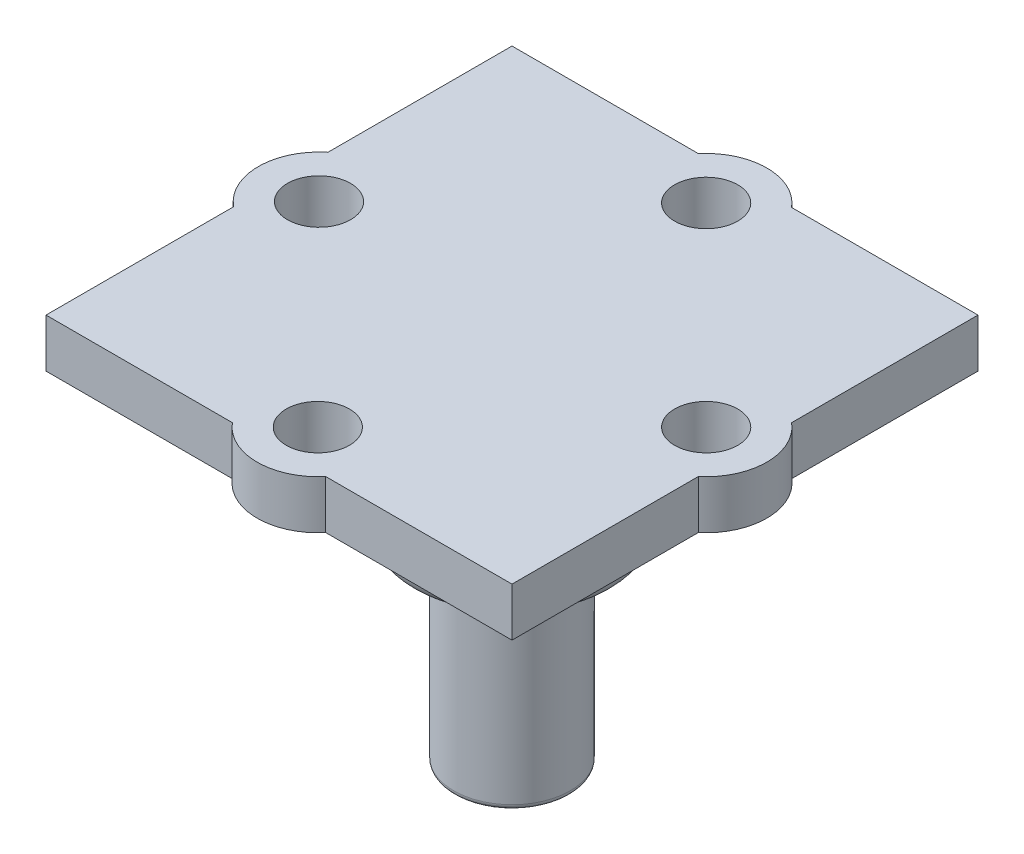
ISO-10303-21;
HEADER;
FILE_DESCRIPTION(('STEP AP214'),'2;1');
FILE_NAME('part.step','',(''),(''),'','','');
FILE_SCHEMA(('AUTOMOTIVE_DESIGN { 1 0 10303 214 1 1 1 1 }'));
ENDSEC;
DATA;
#1=APPLICATION_CONTEXT('core data for automotive mechanical design processes');
#2=APPLICATION_PROTOCOL_DEFINITION('international standard','automotive_design',2000,#1);
#3=PRODUCT_CONTEXT('',#1,'mechanical');
#4=PRODUCT('Part','Part','',(#3));
#5=PRODUCT_RELATED_PRODUCT_CATEGORY('part','',(#4));
#6=PRODUCT_DEFINITION_FORMATION('','',#4);
#7=PRODUCT_DEFINITION_CONTEXT('part definition',#1,'design');
#8=PRODUCT_DEFINITION('design','',#6,#7);
#9=PRODUCT_DEFINITION_SHAPE('','',#8);
#10=(LENGTH_UNIT() NAMED_UNIT(*) SI_UNIT(.MILLI.,.METRE.));
#11=(NAMED_UNIT(*) PLANE_ANGLE_UNIT() SI_UNIT($,.RADIAN.));
#12=(NAMED_UNIT(*) SI_UNIT($,.STERADIAN.) SOLID_ANGLE_UNIT());
#13=UNCERTAINTY_MEASURE_WITH_UNIT(LENGTH_MEASURE(1.E-05),#10,'distance_accuracy_value','');
#14=(GEOMETRIC_REPRESENTATION_CONTEXT(3) GLOBAL_UNCERTAINTY_ASSIGNED_CONTEXT((#13)) GLOBAL_UNIT_ASSIGNED_CONTEXT((#10,
#11,#12)) REPRESENTATION_CONTEXT('',''));
#15=CARTESIAN_POINT('',(0.,0.,0.));
#16=DIRECTION('',(0.,0.,1.));
#17=DIRECTION('',(1.,0.,0.));
#18=AXIS2_PLACEMENT_3D('',#15,#16,#17);
#19=CARTESIAN_POINT('',(20.,5.,0.));
#20=DIRECTION('',(0.,1.,0.));
#21=DIRECTION('',(0.,0.,1.));
#22=AXIS2_PLACEMENT_3D('',#19,#20,#21);
#23=PLANE('',#22);
#24=CARTESIAN_POINT('',(20.,5.,0.));
#25=DIRECTION('',(0.,1.,0.));
#26=DIRECTION('',(0.,0.,1.));
#27=AXIS2_PLACEMENT_3D('',#24,#25,#26);
#28=CIRCLE('',#27,3.25);
#29=CARTESIAN_POINT('',(20.,5.,3.25));
#30=VERTEX_POINT('',#29);
#31=EDGE_CURVE('E577',#30,#30,#28,.T.);
#32=ORIENTED_EDGE('',*,*,#31,.F.);
#33=EDGE_LOOP('',(#32));
#34=FACE_BOUND('',#33,.T.);
#35=CARTESIAN_POINT('',(0.,5.,-20.));
#36=DIRECTION('',(0.,1.,0.));
#37=DIRECTION('',(0.,0.,1.));
#38=AXIS2_PLACEMENT_3D('',#35,#36,#37);
#39=CIRCLE('',#38,3.25);
#40=CARTESIAN_POINT('',(0.,5.,-16.75));
#41=VERTEX_POINT('',#40);
#42=EDGE_CURVE('E391',#41,#41,#39,.T.);
#43=ORIENTED_EDGE('',*,*,#42,.F.);
#44=EDGE_LOOP('',(#43));
#45=FACE_BOUND('',#44,.T.);
#46=DIRECTION('',(1.,0.,0.));
#47=VECTOR('',#46,1.);
#48=CARTESIAN_POINT('',(4.80234317807463,5.,-24.));
#49=LINE('',#48,#47);
#50=CARTESIAN_POINT('',(4.80234317807463,5.,-24.));
#51=VERTEX_POINT('',#50);
#52=CARTESIAN_POINT('',(24.,5.,-24.));
#53=VERTEX_POINT('',#52);
#54=EDGE_CURVE('E416',#51,#53,#49,.T.);
#55=ORIENTED_EDGE('',*,*,#54,.F.);
#56=CARTESIAN_POINT('',(0.,5.,-20.));
#57=DIRECTION('',(0.,1.,0.));
#58=DIRECTION('',(0.,0.,1.));
#59=AXIS2_PLACEMENT_3D('',#56,#57,#58);
#60=CIRCLE('',#59,6.25);
#61=CARTESIAN_POINT('',(-4.80234317807463,5.,-24.));
#62=VERTEX_POINT('',#61);
#63=EDGE_CURVE('E382',#51,#62,#60,.T.);
#64=ORIENTED_EDGE('',*,*,#63,.T.);
#65=DIRECTION('',(1.,0.,0.));
#66=VECTOR('',#65,1.);
#67=CARTESIAN_POINT('',(-24.,5.,-24.));
#68=LINE('',#67,#66);
#69=CARTESIAN_POINT('',(-24.,5.,-24.));
#70=VERTEX_POINT('',#69);
#71=EDGE_CURVE('E365',#70,#62,#68,.T.);
#72=ORIENTED_EDGE('',*,*,#71,.F.);
#73=DIRECTION('',(0.,0.,1.));
#74=VECTOR('',#73,1.);
#75=CARTESIAN_POINT('',(-24.,5.,-24.));
#76=LINE('',#75,#74);
#77=CARTESIAN_POINT('',(-24.,5.,-5.04363246962454));
#78=VERTEX_POINT('',#77);
#79=EDGE_CURVE('E373',#70,#78,#76,.T.);
#80=ORIENTED_EDGE('',*,*,#79,.T.);
#81=CARTESIAN_POINT('',(-20.065667944918,5.,-0.187344660983607));
#82=DIRECTION('',(0.,1.,0.));
#83=DIRECTION('',(0.,0.,1.));
#84=AXIS2_PLACEMENT_3D('',#81,#82,#83);
#85=CIRCLE('',#84,6.25);
#86=CARTESIAN_POINT('',(-24.,5.,4.66894314765733));
#87=VERTEX_POINT('',#86);
#88=EDGE_CURVE('E378',#78,#87,#85,.T.);
#89=ORIENTED_EDGE('',*,*,#88,.T.);
#90=DIRECTION('',(0.,0.,1.));
#91=VECTOR('',#90,1.);
#92=CARTESIAN_POINT('',(-24.,5.,4.66894314765733));
#93=LINE('',#92,#91);
#94=CARTESIAN_POINT('',(-24.,5.,24.));
#95=VERTEX_POINT('',#94);
#96=EDGE_CURVE('E604',#87,#95,#93,.T.);
#97=ORIENTED_EDGE('',*,*,#96,.T.);
#98=DIRECTION('',(1.,0.,0.));
#99=VECTOR('',#98,1.);
#100=CARTESIAN_POINT('',(-24.,5.,24.));
#101=LINE('',#100,#99);
#102=CARTESIAN_POINT('',(-4.80234317807464,5.,24.));
#103=VERTEX_POINT('',#102);
#104=EDGE_CURVE('E602',#95,#103,#101,.T.);
#105=ORIENTED_EDGE('',*,*,#104,.T.);
#106=CARTESIAN_POINT('',(0.,5.,20.));
#107=DIRECTION('',(0.,1.,0.));
#108=DIRECTION('',(0.,0.,1.));
#109=AXIS2_PLACEMENT_3D('',#106,#107,#108);
#110=CIRCLE('',#109,6.25);
#111=CARTESIAN_POINT('',(4.80234317807464,5.,24.));
#112=VERTEX_POINT('',#111);
#113=EDGE_CURVE('E600',#103,#112,#110,.T.);
#114=ORIENTED_EDGE('',*,*,#113,.T.);
#115=DIRECTION('',(1.,0.,0.));
#116=VECTOR('',#115,1.);
#117=CARTESIAN_POINT('',(4.80234317807464,5.,24.));
#118=LINE('',#117,#116);
#119=CARTESIAN_POINT('',(24.,5.,24.));
#120=VERTEX_POINT('',#119);
#121=EDGE_CURVE('E598',#112,#120,#118,.T.);
#122=ORIENTED_EDGE('',*,*,#121,.T.);
#123=DIRECTION('',(0.,0.,1.));
#124=VECTOR('',#123,1.);
#125=CARTESIAN_POINT('',(24.,5.,4.80234317807463));
#126=LINE('',#125,#124);
#127=CARTESIAN_POINT('',(24.,5.,4.80234317807463));
#128=VERTEX_POINT('',#127);
#129=EDGE_CURVE('E595',#128,#120,#126,.T.);
#130=ORIENTED_EDGE('',*,*,#129,.F.);
#131=CARTESIAN_POINT('',(20.,5.,0.));
#132=DIRECTION('',(0.,1.,0.));
#133=DIRECTION('',(0.,0.,1.));
#134=AXIS2_PLACEMENT_3D('',#131,#132,#133);
#135=CIRCLE('',#134,6.25);
#136=CARTESIAN_POINT('',(24.,5.,-4.80234317807464));
#137=VERTEX_POINT('',#136);
#138=EDGE_CURVE('E593',#128,#137,#135,.T.);
#139=ORIENTED_EDGE('',*,*,#138,.T.);
#140=DIRECTION('',(0.,0.,1.));
#141=VECTOR('',#140,1.);
#142=CARTESIAN_POINT('',(24.,5.,-24.));
#143=LINE('',#142,#141);
#144=EDGE_CURVE('E591',#53,#137,#143,.T.);
#145=ORIENTED_EDGE('',*,*,#144,.F.);
#146=EDGE_LOOP('',(#55,#64,#72,#80,#89,#97,#105,#114,#122,#130,#139,#145));
#147=FACE_BOUND('',#146,.T.);
#148=CARTESIAN_POINT('',(0.,5.,20.));
#149=DIRECTION('',(0.,1.,0.));
#150=DIRECTION('',(0.,0.,1.));
#151=AXIS2_PLACEMENT_3D('',#148,#149,#150);
#152=CIRCLE('',#151,3.25);
#153=CARTESIAN_POINT('',(0.,5.,23.25));
#154=VERTEX_POINT('',#153);
#155=EDGE_CURVE('E572',#154,#154,#152,.T.);
#156=ORIENTED_EDGE('',*,*,#155,.F.);
#157=EDGE_LOOP('',(#156));
#158=FACE_BOUND('',#157,.T.);
#159=CARTESIAN_POINT('',(-20.065667944918,5.,-0.187344660983607));
#160=DIRECTION('',(0.,1.,0.));
#161=DIRECTION('',(0.,0.,1.));
#162=AXIS2_PLACEMENT_3D('',#159,#160,#161);
#163=CIRCLE('',#162,3.25);
#164=CARTESIAN_POINT('',(-20.065667944918,5.,3.06265533901639));
#165=VERTEX_POINT('',#164);
#166=EDGE_CURVE('E635',#165,#165,#163,.T.);
#167=ORIENTED_EDGE('',*,*,#166,.F.);
#168=EDGE_LOOP('',(#167));
#169=FACE_BOUND('',#168,.T.);
#170=ADVANCED_FACE('F265',(#34,#45,#147,#158,#169),#23,.T.);
#171=CARTESIAN_POINT('',(20.,0.,0.));
#172=DIRECTION('',(0.,1.,0.));
#173=DIRECTION('',(0.,0.,1.));
#174=AXIS2_PLACEMENT_3D('',#171,#172,#173);
#175=PLANE('',#174);
#176=CARTESIAN_POINT('',(0.,0.,0.));
#177=DIRECTION('',(0.,1.,0.));
#178=DIRECTION('',(0.,0.,1.));
#179=AXIS2_PLACEMENT_3D('',#176,#177,#178);
#180=CIRCLE('',#179,12.5671935359598);
#181=CARTESIAN_POINT('',(0.,0.,12.5671935359598));
#182=VERTEX_POINT('',#181);
#183=EDGE_CURVE('E454',#182,#182,#180,.T.);
#184=ORIENTED_EDGE('',*,*,#183,.T.);
#185=EDGE_LOOP('',(#184));
#186=FACE_BOUND('',#185,.T.);
#187=DIRECTION('',(1.,0.,0.));
#188=VECTOR('',#187,1.);
#189=CARTESIAN_POINT('',(4.80234317807463,0.,-24.));
#190=LINE('',#189,#188);
#191=CARTESIAN_POINT('',(4.80234317807463,0.,-24.));
#192=VERTEX_POINT('',#191);
#193=CARTESIAN_POINT('',(24.,0.,-24.));
#194=VERTEX_POINT('',#193);
#195=EDGE_CURVE('E387',#192,#194,#190,.T.);
#196=ORIENTED_EDGE('',*,*,#195,.T.);
#197=DIRECTION('',(0.,0.,1.));
#198=VECTOR('',#197,1.);
#199=CARTESIAN_POINT('',(24.,0.,-24.));
#200=LINE('',#199,#198);
#201=CARTESIAN_POINT('',(24.,0.,-4.80234317807464));
#202=VERTEX_POINT('',#201);
#203=EDGE_CURVE('E390',#194,#202,#200,.T.);
#204=ORIENTED_EDGE('',*,*,#203,.T.);
#205=CARTESIAN_POINT('',(20.,0.,0.));
#206=DIRECTION('',(0.,1.,0.));
#207=DIRECTION('',(0.,0.,1.));
#208=AXIS2_PLACEMENT_3D('',#205,#206,#207);
#209=CIRCLE('',#208,6.25);
#210=CARTESIAN_POINT('',(24.,0.,4.80234317807463));
#211=VERTEX_POINT('',#210);
#212=EDGE_CURVE('E394',#211,#202,#209,.T.);
#213=ORIENTED_EDGE('',*,*,#212,.F.);
#214=DIRECTION('',(0.,0.,1.));
#215=VECTOR('',#214,1.);
#216=CARTESIAN_POINT('',(24.,0.,4.80234317807463));
#217=LINE('',#216,#215);
#218=CARTESIAN_POINT('',(24.,0.,24.));
#219=VERTEX_POINT('',#218);
#220=EDGE_CURVE('E397',#211,#219,#217,.T.);
#221=ORIENTED_EDGE('',*,*,#220,.T.);
#222=DIRECTION('',(1.,0.,0.));
#223=VECTOR('',#222,1.);
#224=CARTESIAN_POINT('',(4.80234317807464,0.,24.));
#225=LINE('',#224,#223);
#226=CARTESIAN_POINT('',(4.80234317807464,0.,24.));
#227=VERTEX_POINT('',#226);
#228=EDGE_CURVE('E400',#227,#219,#225,.T.);
#229=ORIENTED_EDGE('',*,*,#228,.F.);
#230=CARTESIAN_POINT('',(0.,0.,20.));
#231=DIRECTION('',(0.,1.,0.));
#232=DIRECTION('',(0.,0.,1.));
#233=AXIS2_PLACEMENT_3D('',#230,#231,#232);
#234=CIRCLE('',#233,6.25);
#235=CARTESIAN_POINT('',(-4.80234317807464,0.,24.));
#236=VERTEX_POINT('',#235);
#237=EDGE_CURVE('E403',#236,#227,#234,.T.);
#238=ORIENTED_EDGE('',*,*,#237,.F.);
#239=DIRECTION('',(1.,0.,0.));
#240=VECTOR('',#239,1.);
#241=CARTESIAN_POINT('',(-24.,0.,24.));
#242=LINE('',#241,#240);
#243=CARTESIAN_POINT('',(-24.,0.,24.));
#244=VERTEX_POINT('',#243);
#245=EDGE_CURVE('E405',#244,#236,#242,.T.);
#246=ORIENTED_EDGE('',*,*,#245,.F.);
#247=DIRECTION('',(0.,0.,1.));
#248=VECTOR('',#247,1.);
#249=CARTESIAN_POINT('',(-24.,0.,4.66894314765733));
#250=LINE('',#249,#248);
#251=CARTESIAN_POINT('',(-24.,0.,4.66894314765733));
#252=VERTEX_POINT('',#251);
#253=EDGE_CURVE('E407',#252,#244,#250,.T.);
#254=ORIENTED_EDGE('',*,*,#253,.F.);
#255=CARTESIAN_POINT('',(-20.065667944918,0.,-0.187344660983607));
#256=DIRECTION('',(0.,1.,0.));
#257=DIRECTION('',(0.,0.,1.));
#258=AXIS2_PLACEMENT_3D('',#255,#256,#257);
#259=CIRCLE('',#258,6.25);
#260=CARTESIAN_POINT('',(-24.,0.,-5.04363246962454));
#261=VERTEX_POINT('',#260);
#262=EDGE_CURVE('E409',#261,#252,#259,.T.);
#263=ORIENTED_EDGE('',*,*,#262,.F.);
#264=DIRECTION('',(0.,0.,1.));
#265=VECTOR('',#264,1.);
#266=CARTESIAN_POINT('',(-24.,0.,-24.));
#267=LINE('',#266,#265);
#268=CARTESIAN_POINT('',(-24.,0.,-24.));
#269=VERTEX_POINT('',#268);
#270=EDGE_CURVE('E411',#269,#261,#267,.T.);
#271=ORIENTED_EDGE('',*,*,#270,.F.);
#272=DIRECTION('',(1.,0.,0.));
#273=VECTOR('',#272,1.);
#274=CARTESIAN_POINT('',(-24.,0.,-24.));
#275=LINE('',#274,#273);
#276=CARTESIAN_POINT('',(-4.80234317807463,0.,-24.));
#277=VERTEX_POINT('',#276);
#278=EDGE_CURVE('E367',#269,#277,#275,.T.);
#279=ORIENTED_EDGE('',*,*,#278,.T.);
#280=CARTESIAN_POINT('',(0.,0.,-20.));
#281=DIRECTION('',(0.,1.,0.));
#282=DIRECTION('',(0.,0.,1.));
#283=AXIS2_PLACEMENT_3D('',#280,#281,#282);
#284=CIRCLE('',#283,6.25);
#285=EDGE_CURVE('E414',#192,#277,#284,.T.);
#286=ORIENTED_EDGE('',*,*,#285,.F.);
#287=EDGE_LOOP('',(#196,#204,#213,#221,#229,#238,#246,#254,#263,#271,#279,#286));
#288=FACE_BOUND('',#287,.T.);
#289=CARTESIAN_POINT('',(0.,0.,-20.));
#290=DIRECTION('',(0.,1.,0.));
#291=DIRECTION('',(0.,0.,1.));
#292=AXIS2_PLACEMENT_3D('',#289,#290,#291);
#293=CIRCLE('',#292,3.25);
#294=CARTESIAN_POINT('',(0.,0.,-16.75));
#295=VERTEX_POINT('',#294);
#296=EDGE_CURVE('E579',#295,#295,#293,.T.);
#297=ORIENTED_EDGE('',*,*,#296,.T.);
#298=EDGE_LOOP('',(#297));
#299=FACE_BOUND('',#298,.T.);
#300=CARTESIAN_POINT('',(0.,0.,20.));
#301=DIRECTION('',(0.,1.,0.));
#302=DIRECTION('',(0.,0.,1.));
#303=AXIS2_PLACEMENT_3D('',#300,#301,#302);
#304=CIRCLE('',#303,3.25);
#305=CARTESIAN_POINT('',(0.,0.,23.25));
#306=VERTEX_POINT('',#305);
#307=EDGE_CURVE('E575',#306,#306,#304,.T.);
#308=ORIENTED_EDGE('',*,*,#307,.T.);
#309=EDGE_LOOP('',(#308));
#310=FACE_BOUND('',#309,.T.);
#311=CARTESIAN_POINT('',(20.,0.,0.));
#312=DIRECTION('',(0.,1.,0.));
#313=DIRECTION('',(0.,0.,1.));
#314=AXIS2_PLACEMENT_3D('',#311,#312,#313);
#315=CIRCLE('',#314,3.25);
#316=CARTESIAN_POINT('',(20.,0.,3.25));
#317=VERTEX_POINT('',#316);
#318=EDGE_CURVE('E582',#317,#317,#315,.T.);
#319=ORIENTED_EDGE('',*,*,#318,.T.);
#320=EDGE_LOOP('',(#319));
#321=FACE_BOUND('',#320,.T.);
#322=CARTESIAN_POINT('',(-20.065667944918,0.,-0.187344660983607));
#323=DIRECTION('',(0.,1.,0.));
#324=DIRECTION('',(0.,0.,1.));
#325=AXIS2_PLACEMENT_3D('',#322,#323,#324);
#326=CIRCLE('',#325,3.25);
#327=CARTESIAN_POINT('',(-20.065667944918,0.,3.06265533901639));
#328=VERTEX_POINT('',#327);
#329=EDGE_CURVE('E633',#328,#328,#326,.T.);
#330=ORIENTED_EDGE('',*,*,#329,.T.);
#331=EDGE_LOOP('',(#330));
#332=FACE_BOUND('',#331,.T.);
#333=ADVANCED_FACE('F471',(#186,#288,#299,#310,#321,#332),#175,.F.);
#334=CARTESIAN_POINT('',(4.80234317807463,5.,-24.));
#335=DIRECTION('',(0.,0.,-1.));
#336=DIRECTION('',(-1.,0.,0.));
#337=AXIS2_PLACEMENT_3D('',#334,#335,#336);
#338=PLANE('',#337);
#339=ORIENTED_EDGE('',*,*,#195,.F.);
#340=DIRECTION('',(0.,-1.,0.));
#341=VECTOR('',#340,1.);
#342=CARTESIAN_POINT('',(4.80234317807463,5.,-24.));
#343=LINE('',#342,#341);
#344=EDGE_CURVE('E282',#51,#192,#343,.T.);
#345=ORIENTED_EDGE('',*,*,#344,.F.);
#346=ORIENTED_EDGE('',*,*,#54,.T.);
#347=DIRECTION('',(0.,-1.,0.));
#348=VECTOR('',#347,1.);
#349=CARTESIAN_POINT('',(24.,5.,-24.));
#350=LINE('',#349,#348);
#351=EDGE_CURVE('E335',#53,#194,#350,.T.);
#352=ORIENTED_EDGE('',*,*,#351,.T.);
#353=EDGE_LOOP('',(#339,#345,#346,#352));
#354=FACE_BOUND('',#353,.T.);
#355=ADVANCED_FACE('F477',(#354),#338,.T.);
#356=CARTESIAN_POINT('',(0.,5.,-20.));
#357=DIRECTION('',(0.,-1.,0.));
#358=DIRECTION('',(0.,0.,-1.));
#359=AXIS2_PLACEMENT_3D('',#356,#357,#358);
#360=CYLINDRICAL_SURFACE('',#359,6.25);
#361=ORIENTED_EDGE('',*,*,#285,.T.);
#362=DIRECTION('',(0.,-1.,0.));
#363=VECTOR('',#362,1.);
#364=CARTESIAN_POINT('',(-4.80234317807463,5.,-24.));
#365=LINE('',#364,#363);
#366=EDGE_CURVE('E324',#62,#277,#365,.T.);
#367=ORIENTED_EDGE('',*,*,#366,.F.);
#368=ORIENTED_EDGE('',*,*,#63,.F.);
#369=ORIENTED_EDGE('',*,*,#344,.T.);
#370=EDGE_LOOP('',(#361,#367,#368,#369));
#371=FACE_BOUND('',#370,.T.);
#372=ADVANCED_FACE('F486',(#371),#360,.T.);
#373=CARTESIAN_POINT('',(-24.,5.,-24.));
#374=DIRECTION('',(0.,0.,-1.));
#375=DIRECTION('',(-1.,0.,0.));
#376=AXIS2_PLACEMENT_3D('',#373,#374,#375);
#377=PLANE('',#376);
#378=ORIENTED_EDGE('',*,*,#278,.F.);
#379=DIRECTION('',(0.,-1.,0.));
#380=VECTOR('',#379,1.);
#381=CARTESIAN_POINT('',(-24.,5.,-24.));
#382=LINE('',#381,#380);
#383=EDGE_CURVE('E361',#70,#269,#382,.T.);
#384=ORIENTED_EDGE('',*,*,#383,.F.);
#385=ORIENTED_EDGE('',*,*,#71,.T.);
#386=ORIENTED_EDGE('',*,*,#366,.T.);
#387=EDGE_LOOP('',(#378,#384,#385,#386));
#388=FACE_BOUND('',#387,.T.);
#389=ADVANCED_FACE('F363',(#388),#377,.T.);
#390=CARTESIAN_POINT('',(-24.,5.,-24.));
#391=DIRECTION('',(1.,0.,0.));
#392=DIRECTION('',(0.,0.,-1.));
#393=AXIS2_PLACEMENT_3D('',#390,#391,#392);
#394=PLANE('',#393);
#395=ORIENTED_EDGE('',*,*,#270,.T.);
#396=DIRECTION('',(0.,-1.,0.));
#397=VECTOR('',#396,1.);
#398=CARTESIAN_POINT('',(-24.,5.,-5.04363246962454));
#399=LINE('',#398,#397);
#400=EDGE_CURVE('E370',#78,#261,#399,.T.);
#401=ORIENTED_EDGE('',*,*,#400,.F.);
#402=ORIENTED_EDGE('',*,*,#79,.F.);
#403=ORIENTED_EDGE('',*,*,#383,.T.);
#404=EDGE_LOOP('',(#395,#401,#402,#403));
#405=FACE_BOUND('',#404,.T.);
#406=ADVANCED_FACE('F374',(#405),#394,.F.);
#407=CARTESIAN_POINT('',(-20.065667944918,5.,-0.187344660983607));
#408=DIRECTION('',(0.,-1.,0.));
#409=DIRECTION('',(0.,0.,-1.));
#410=AXIS2_PLACEMENT_3D('',#407,#408,#409);
#411=CYLINDRICAL_SURFACE('',#410,6.25);
#412=ORIENTED_EDGE('',*,*,#262,.T.);
#413=DIRECTION('',(0.,-1.,0.));
#414=VECTOR('',#413,1.);
#415=CARTESIAN_POINT('',(-24.,5.,4.66894314765733));
#416=LINE('',#415,#414);
#417=EDGE_CURVE('E421',#87,#252,#416,.T.);
#418=ORIENTED_EDGE('',*,*,#417,.F.);
#419=ORIENTED_EDGE('',*,*,#88,.F.);
#420=ORIENTED_EDGE('',*,*,#400,.T.);
#421=EDGE_LOOP('',(#412,#418,#419,#420));
#422=FACE_BOUND('',#421,.T.);
#423=ADVANCED_FACE('F493',(#422),#411,.T.);
#424=CARTESIAN_POINT('',(-24.,5.,4.66894314765733));
#425=DIRECTION('',(1.,0.,0.));
#426=DIRECTION('',(0.,0.,-1.));
#427=AXIS2_PLACEMENT_3D('',#424,#425,#426);
#428=PLANE('',#427);
#429=ORIENTED_EDGE('',*,*,#253,.T.);
#430=DIRECTION('',(0.,-1.,0.));
#431=VECTOR('',#430,1.);
#432=CARTESIAN_POINT('',(-24.,5.,24.));
#433=LINE('',#432,#431);
#434=EDGE_CURVE('E424',#95,#244,#433,.T.);
#435=ORIENTED_EDGE('',*,*,#434,.F.);
#436=ORIENTED_EDGE('',*,*,#96,.F.);
#437=ORIENTED_EDGE('',*,*,#417,.T.);
#438=EDGE_LOOP('',(#429,#435,#436,#437));
#439=FACE_BOUND('',#438,.T.);
#440=ADVANCED_FACE('F496',(#439),#428,.F.);
#441=CARTESIAN_POINT('',(-24.,5.,24.));
#442=DIRECTION('',(0.,0.,-1.));
#443=DIRECTION('',(-1.,0.,0.));
#444=AXIS2_PLACEMENT_3D('',#441,#442,#443);
#445=PLANE('',#444);
#446=ORIENTED_EDGE('',*,*,#245,.T.);
#447=DIRECTION('',(0.,-1.,0.));
#448=VECTOR('',#447,1.);
#449=CARTESIAN_POINT('',(-4.80234317807464,5.,24.));
#450=LINE('',#449,#448);
#451=EDGE_CURVE('E427',#103,#236,#450,.T.);
#452=ORIENTED_EDGE('',*,*,#451,.F.);
#453=ORIENTED_EDGE('',*,*,#104,.F.);
#454=ORIENTED_EDGE('',*,*,#434,.T.);
#455=EDGE_LOOP('',(#446,#452,#453,#454));
#456=FACE_BOUND('',#455,.T.);
#457=ADVANCED_FACE('F500',(#456),#445,.F.);
#458=CARTESIAN_POINT('',(0.,5.,20.));
#459=DIRECTION('',(0.,-1.,0.));
#460=DIRECTION('',(0.,0.,-1.));
#461=AXIS2_PLACEMENT_3D('',#458,#459,#460);
#462=CYLINDRICAL_SURFACE('',#461,6.25);
#463=ORIENTED_EDGE('',*,*,#237,.T.);
#464=DIRECTION('',(0.,-1.,0.));
#465=VECTOR('',#464,1.);
#466=CARTESIAN_POINT('',(4.80234317807464,5.,24.));
#467=LINE('',#466,#465);
#468=EDGE_CURVE('E430',#112,#227,#467,.T.);
#469=ORIENTED_EDGE('',*,*,#468,.F.);
#470=ORIENTED_EDGE('',*,*,#113,.F.);
#471=ORIENTED_EDGE('',*,*,#451,.T.);
#472=EDGE_LOOP('',(#463,#469,#470,#471));
#473=FACE_BOUND('',#472,.T.);
#474=ADVANCED_FACE('F504',(#473),#462,.T.);
#475=CARTESIAN_POINT('',(4.80234317807464,5.,24.));
#476=DIRECTION('',(0.,0.,-1.));
#477=DIRECTION('',(-1.,0.,0.));
#478=AXIS2_PLACEMENT_3D('',#475,#476,#477);
#479=PLANE('',#478);
#480=ORIENTED_EDGE('',*,*,#228,.T.);
#481=DIRECTION('',(0.,-1.,0.));
#482=VECTOR('',#481,1.);
#483=CARTESIAN_POINT('',(24.,5.,24.));
#484=LINE('',#483,#482);
#485=EDGE_CURVE('E433',#120,#219,#484,.T.);
#486=ORIENTED_EDGE('',*,*,#485,.F.);
#487=ORIENTED_EDGE('',*,*,#121,.F.);
#488=ORIENTED_EDGE('',*,*,#468,.T.);
#489=EDGE_LOOP('',(#480,#486,#487,#488));
#490=FACE_BOUND('',#489,.T.);
#491=ADVANCED_FACE('F508',(#490),#479,.F.);
#492=CARTESIAN_POINT('',(24.,5.,4.80234317807463));
#493=DIRECTION('',(1.,0.,0.));
#494=DIRECTION('',(0.,0.,-1.));
#495=AXIS2_PLACEMENT_3D('',#492,#493,#494);
#496=PLANE('',#495);
#497=ORIENTED_EDGE('',*,*,#220,.F.);
#498=DIRECTION('',(0.,-1.,0.));
#499=VECTOR('',#498,1.);
#500=CARTESIAN_POINT('',(24.,5.,4.80234317807463));
#501=LINE('',#500,#499);
#502=EDGE_CURVE('E435',#128,#211,#501,.T.);
#503=ORIENTED_EDGE('',*,*,#502,.F.);
#504=ORIENTED_EDGE('',*,*,#129,.T.);
#505=ORIENTED_EDGE('',*,*,#485,.T.);
#506=EDGE_LOOP('',(#497,#503,#504,#505));
#507=FACE_BOUND('',#506,.T.);
#508=ADVANCED_FACE('F512',(#507),#496,.T.);
#509=CARTESIAN_POINT('',(20.,5.,0.));
#510=DIRECTION('',(0.,-1.,0.));
#511=DIRECTION('',(0.,0.,-1.));
#512=AXIS2_PLACEMENT_3D('',#509,#510,#511);
#513=CYLINDRICAL_SURFACE('',#512,6.25);
#514=ORIENTED_EDGE('',*,*,#212,.T.);
#515=DIRECTION('',(0.,-1.,0.));
#516=VECTOR('',#515,1.);
#517=CARTESIAN_POINT('',(24.,5.,-4.80234317807464));
#518=LINE('',#517,#516);
#519=EDGE_CURVE('E437',#137,#202,#518,.T.);
#520=ORIENTED_EDGE('',*,*,#519,.F.);
#521=ORIENTED_EDGE('',*,*,#138,.F.);
#522=ORIENTED_EDGE('',*,*,#502,.T.);
#523=EDGE_LOOP('',(#514,#520,#521,#522));
#524=FACE_BOUND('',#523,.T.);
#525=ADVANCED_FACE('F516',(#524),#513,.T.);
#526=CARTESIAN_POINT('',(24.,5.,-24.));
#527=DIRECTION('',(1.,0.,0.));
#528=DIRECTION('',(0.,0.,-1.));
#529=AXIS2_PLACEMENT_3D('',#526,#527,#528);
#530=PLANE('',#529);
#531=ORIENTED_EDGE('',*,*,#203,.F.);
#532=ORIENTED_EDGE('',*,*,#351,.F.);
#533=ORIENTED_EDGE('',*,*,#144,.T.);
#534=ORIENTED_EDGE('',*,*,#519,.T.);
#535=EDGE_LOOP('',(#531,#532,#533,#534));
#536=FACE_BOUND('',#535,.T.);
#537=ADVANCED_FACE('F520',(#536),#530,.T.);
#538=CARTESIAN_POINT('',(0.,5.,-20.));
#539=DIRECTION('',(0.,-1.,0.));
#540=DIRECTION('',(0.,0.,-1.));
#541=AXIS2_PLACEMENT_3D('',#538,#539,#540);
#542=CYLINDRICAL_SURFACE('',#541,3.25);
#543=ORIENTED_EDGE('',*,*,#42,.T.);
#544=EDGE_LOOP('',(#543));
#545=FACE_BOUND('',#544,.T.);
#546=ORIENTED_EDGE('',*,*,#296,.F.);
#547=EDGE_LOOP('',(#546));
#548=FACE_BOUND('',#547,.T.);
#549=ADVANCED_FACE('F483',(#545,#548),#542,.F.);
#550=CARTESIAN_POINT('',(0.,5.,20.));
#551=DIRECTION('',(0.,-1.,0.));
#552=DIRECTION('',(0.,0.,-1.));
#553=AXIS2_PLACEMENT_3D('',#550,#551,#552);
#554=CYLINDRICAL_SURFACE('',#553,3.25);
#555=ORIENTED_EDGE('',*,*,#155,.T.);
#556=EDGE_LOOP('',(#555));
#557=FACE_BOUND('',#556,.T.);
#558=ORIENTED_EDGE('',*,*,#307,.F.);
#559=EDGE_LOOP('',(#558));
#560=FACE_BOUND('',#559,.T.);
#561=ADVANCED_FACE('F561',(#557,#560),#554,.F.);
#562=CARTESIAN_POINT('',(20.,5.,0.));
#563=DIRECTION('',(0.,-1.,0.));
#564=DIRECTION('',(0.,0.,-1.));
#565=AXIS2_PLACEMENT_3D('',#562,#563,#564);
#566=CYLINDRICAL_SURFACE('',#565,3.25);
#567=ORIENTED_EDGE('',*,*,#31,.T.);
#568=EDGE_LOOP('',(#567));
#569=FACE_BOUND('',#568,.T.);
#570=ORIENTED_EDGE('',*,*,#318,.F.);
#571=EDGE_LOOP('',(#570));
#572=FACE_BOUND('',#571,.T.);
#573=ADVANCED_FACE('F558',(#569,#572),#566,.F.);
#574=CARTESIAN_POINT('',(-20.065667944918,5.,-0.187344660983607));
#575=DIRECTION('',(0.,-1.,0.));
#576=DIRECTION('',(0.,0.,-1.));
#577=AXIS2_PLACEMENT_3D('',#574,#575,#576);
#578=CYLINDRICAL_SURFACE('',#577,3.25);
#579=ORIENTED_EDGE('',*,*,#166,.T.);
#580=EDGE_LOOP('',(#579));
#581=FACE_BOUND('',#580,.T.);
#582=ORIENTED_EDGE('',*,*,#329,.F.);
#583=EDGE_LOOP('',(#582));
#584=FACE_BOUND('',#583,.T.);
#585=ADVANCED_FACE('F554',(#581,#584),#578,.F.);
#586=CARTESIAN_POINT('',(0.,-15.,0.));
#587=DIRECTION('',(0.,1.,0.));
#588=DIRECTION('',(0.,0.,1.));
#589=AXIS2_PLACEMENT_3D('',#586,#587,#588);
#590=CYLINDRICAL_SURFACE('',#589,10.5671935359598);
#591=CARTESIAN_POINT('',(0.,-13.,0.));
#592=DIRECTION('',(0.,-1.,0.));
#593=DIRECTION('',(0.,0.,-1.));
#594=AXIS2_PLACEMENT_3D('',#591,#592,#593);
#595=CIRCLE('',#594,10.5671935359598);
#596=CARTESIAN_POINT('',(0.,-13.,-10.5671935359598));
#597=VERTEX_POINT('',#596);
#598=EDGE_CURVE('E448',#597,#597,#595,.F.);
#599=ORIENTED_EDGE('',*,*,#598,.T.);
#600=EDGE_LOOP('',(#599));
#601=FACE_BOUND('',#600,.T.);
#602=CARTESIAN_POINT('',(0.,-2.,0.));
#603=DIRECTION('',(0.,1.,0.));
#604=DIRECTION('',(0.,0.,1.));
#605=AXIS2_PLACEMENT_3D('',#602,#603,#604);
#606=CIRCLE('',#605,10.5671935359598);
#607=CARTESIAN_POINT('',(0.,-2.,10.5671935359598));
#608=VERTEX_POINT('',#607);
#609=EDGE_CURVE('E445',#608,#608,#606,.F.);
#610=ORIENTED_EDGE('',*,*,#609,.T.);
#611=EDGE_LOOP('',(#610));
#612=FACE_BOUND('',#611,.T.);
#613=ADVANCED_FACE('F548',(#601,#612),#590,.T.);
#614=CARTESIAN_POINT('',(0.,-15.,0.));
#615=DIRECTION('',(0.,-1.,0.));
#616=DIRECTION('',(0.,0.,-1.));
#617=AXIS2_PLACEMENT_3D('',#614,#615,#616);
#618=PLANE('',#617);
#619=CARTESIAN_POINT('',(0.,-15.,0.));
#620=DIRECTION('',(0.,-1.,0.));
#621=DIRECTION('',(0.,0.,-1.));
#622=AXIS2_PLACEMENT_3D('',#619,#620,#621);
#623=CIRCLE('',#622,8.56719353595979);
#624=CARTESIAN_POINT('',(0.,-15.,-8.56719353595979));
#625=VERTEX_POINT('',#624);
#626=EDGE_CURVE('E442',#625,#625,#623,.T.);
#627=ORIENTED_EDGE('',*,*,#626,.T.);
#628=EDGE_LOOP('',(#627));
#629=FACE_BOUND('',#628,.T.);
#630=CARTESIAN_POINT('',(0.,-15.,0.));
#631=DIRECTION('',(0.,-1.,0.));
#632=DIRECTION('',(0.,0.,-1.));
#633=AXIS2_PLACEMENT_3D('',#630,#631,#632);
#634=CIRCLE('',#633,8.);
#635=CARTESIAN_POINT('',(0.,-15.,-8.));
#636=VERTEX_POINT('',#635);
#637=EDGE_CURVE('E418',#636,#636,#634,.F.);
#638=ORIENTED_EDGE('',*,*,#637,.T.);
#639=EDGE_LOOP('',(#638));
#640=FACE_BOUND('',#639,.T.);
#641=ADVANCED_FACE('F540',(#629,#640),#618,.T.);
#642=CARTESIAN_POINT('',(0.,-35.,0.));
#643=DIRECTION('',(0.,1.,0.));
#644=DIRECTION('',(0.,0.,1.));
#645=AXIS2_PLACEMENT_3D('',#642,#643,#644);
#646=CYLINDRICAL_SURFACE('',#645,6.);
#647=CARTESIAN_POINT('',(0.,-34.44,0.));
#648=DIRECTION('',(0.,-1.,0.));
#649=DIRECTION('',(0.,0.,-1.));
#650=AXIS2_PLACEMENT_3D('',#647,#648,#649);
#651=CIRCLE('',#650,6.);
#652=CARTESIAN_POINT('',(0.,-34.44,-6.));
#653=VERTEX_POINT('',#652);
#654=EDGE_CURVE('E12',#653,#653,#651,.F.);
#655=ORIENTED_EDGE('',*,*,#654,.T.);
#656=EDGE_LOOP('',(#655));
#657=FACE_BOUND('',#656,.T.);
#658=CARTESIAN_POINT('',(0.,-17.,0.));
#659=DIRECTION('',(0.,-1.,0.));
#660=DIRECTION('',(0.,0.,-1.));
#661=AXIS2_PLACEMENT_3D('',#658,#659,#660);
#662=CIRCLE('',#661,6.);
#663=CARTESIAN_POINT('',(0.,-17.,-6.));
#664=VERTEX_POINT('',#663);
#665=EDGE_CURVE('E451',#664,#664,#662,.T.);
#666=ORIENTED_EDGE('',*,*,#665,.T.);
#667=EDGE_LOOP('',(#666));
#668=FACE_BOUND('',#667,.T.);
#669=ADVANCED_FACE('F538',(#657,#668),#646,.T.);
#670=CARTESIAN_POINT('',(0.,-35.,0.));
#671=DIRECTION('',(0.,-1.,0.));
#672=DIRECTION('',(0.,0.,-1.));
#673=AXIS2_PLACEMENT_3D('',#670,#671,#672);
#674=PLANE('',#673);
#675=CARTESIAN_POINT('',(0.,-35.,0.));
#676=DIRECTION('',(0.,-1.,0.));
#677=DIRECTION('',(0.,0.,-1.));
#678=AXIS2_PLACEMENT_3D('',#675,#676,#677);
#679=CIRCLE('',#678,5.44);
#680=CARTESIAN_POINT('',(0.,-35.,-5.44));
#681=VERTEX_POINT('',#680);
#682=EDGE_CURVE('E274',#681,#681,#679,.T.);
#683=ORIENTED_EDGE('',*,*,#682,.T.);
#684=EDGE_LOOP('',(#683));
#685=FACE_BOUND('',#684,.T.);
#686=ADVANCED_FACE('F459',(#685),#674,.T.);
#687=CARTESIAN_POINT('',(0.,-13.,0.));
#688=DIRECTION('',(0.,-1.,0.));
#689=DIRECTION('',(0.,0.,-1.));
#690=AXIS2_PLACEMENT_3D('',#687,#688,#689);
#691=TOROIDAL_SURFACE('',#690,8.56719353595979,2.);
#692=ORIENTED_EDGE('',*,*,#598,.F.);
#693=EDGE_LOOP('',(#692));
#694=FACE_BOUND('',#693,.T.);
#695=ORIENTED_EDGE('',*,*,#626,.F.);
#696=EDGE_LOOP('',(#695));
#697=FACE_BOUND('',#696,.T.);
#698=ADVANCED_FACE('F526',(#694,#697),#691,.T.);
#699=CARTESIAN_POINT('',(0.,-17.,0.));
#700=DIRECTION('',(0.,-1.,0.));
#701=DIRECTION('',(0.,0.,-1.));
#702=AXIS2_PLACEMENT_3D('',#699,#700,#701);
#703=TOROIDAL_SURFACE('',#702,8.,2.);
#704=ORIENTED_EDGE('',*,*,#637,.F.);
#705=EDGE_LOOP('',(#704));
#706=FACE_BOUND('',#705,.T.);
#707=ORIENTED_EDGE('',*,*,#665,.F.);
#708=EDGE_LOOP('',(#707));
#709=FACE_BOUND('',#708,.T.);
#710=ADVANCED_FACE('F467',(#706,#709),#703,.F.);
#711=CARTESIAN_POINT('',(0.,-2.,0.));
#712=DIRECTION('',(0.,1.,0.));
#713=DIRECTION('',(0.,0.,1.));
#714=AXIS2_PLACEMENT_3D('',#711,#712,#713);
#715=TOROIDAL_SURFACE('',#714,12.5671935359598,2.);
#716=ORIENTED_EDGE('',*,*,#183,.F.);
#717=EDGE_LOOP('',(#716));
#718=FACE_BOUND('',#717,.T.);
#719=ORIENTED_EDGE('',*,*,#609,.F.);
#720=EDGE_LOOP('',(#719));
#721=FACE_BOUND('',#720,.T.);
#722=ADVANCED_FACE('F462',(#718,#721),#715,.F.);
#723=CARTESIAN_POINT('',(0.,-34.44,0.));
#724=DIRECTION('',(0.,-1.,0.));
#725=DIRECTION('',(0.,0.,-1.));
#726=AXIS2_PLACEMENT_3D('',#723,#724,#725);
#727=TOROIDAL_SURFACE('',#726,5.44,0.56);
#728=ORIENTED_EDGE('',*,*,#654,.F.);
#729=EDGE_LOOP('',(#728));
#730=FACE_BOUND('',#729,.T.);
#731=ORIENTED_EDGE('',*,*,#682,.F.);
#732=EDGE_LOOP('',(#731));
#733=FACE_BOUND('',#732,.T.);
#734=ADVANCED_FACE('F267',(#730,#733),#727,.T.);
#735=CLOSED_SHELL('',(#170,#333,#355,#372,#389,#406,#423,#440,#457,#474,#491,#508,#525,#537,
#549,#561,#573,#585,#613,#641,#669,#686,#698,#710,#722,#734));
#736=MANIFOLD_SOLID_BREP('B2',#735);
#737=ADVANCED_BREP_SHAPE_REPRESENTATION('',(#18,#736),#14);
#738=SHAPE_DEFINITION_REPRESENTATION(#9,#737);
ENDSEC;
END-ISO-10303-21;
